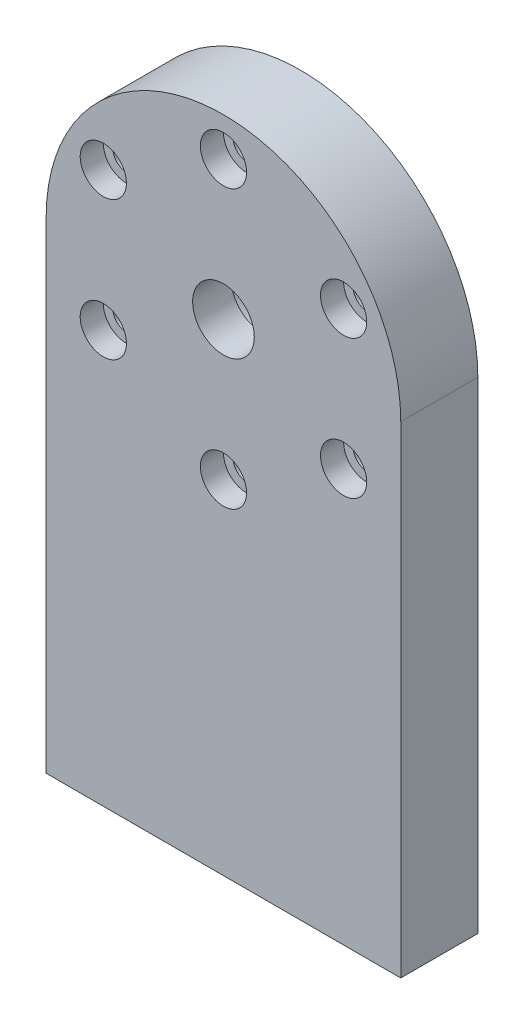
ISO-10303-21;
HEADER;
FILE_DESCRIPTION(('STEP AP214'),'2;1');
FILE_NAME('part.step','',(''),(''),'','','');
FILE_SCHEMA(('AUTOMOTIVE_DESIGN { 1 0 10303 214 1 1 1 1 }'));
ENDSEC;
DATA;
#1=APPLICATION_CONTEXT('core data for automotive mechanical design processes');
#2=APPLICATION_PROTOCOL_DEFINITION('international standard','automotive_design',2000,#1);
#3=PRODUCT_CONTEXT('',#1,'mechanical');
#4=PRODUCT('Part','Part','',(#3));
#5=PRODUCT_RELATED_PRODUCT_CATEGORY('part','',(#4));
#6=PRODUCT_DEFINITION_FORMATION('','',#4);
#7=PRODUCT_DEFINITION_CONTEXT('part definition',#1,'design');
#8=PRODUCT_DEFINITION('design','',#6,#7);
#9=PRODUCT_DEFINITION_SHAPE('','',#8);
#10=(LENGTH_UNIT() NAMED_UNIT(*) SI_UNIT(.MILLI.,.METRE.));
#11=(NAMED_UNIT(*) PLANE_ANGLE_UNIT() SI_UNIT($,.RADIAN.));
#12=(NAMED_UNIT(*) SI_UNIT($,.STERADIAN.) SOLID_ANGLE_UNIT());
#13=UNCERTAINTY_MEASURE_WITH_UNIT(LENGTH_MEASURE(1.E-05),#10,'distance_accuracy_value','');
#14=(GEOMETRIC_REPRESENTATION_CONTEXT(3) GLOBAL_UNCERTAINTY_ASSIGNED_CONTEXT((#13)) GLOBAL_UNIT_ASSIGNED_CONTEXT((#10,
#11,#12)) REPRESENTATION_CONTEXT('',''));
#15=CARTESIAN_POINT('',(0.,0.,0.));
#16=DIRECTION('',(0.,0.,1.));
#17=DIRECTION('',(1.,0.,0.));
#18=AXIS2_PLACEMENT_3D('',#15,#16,#17);
#19=CARTESIAN_POINT('',(0.,125.,10.));
#20=DIRECTION('',(0.,0.,-1.));
#21=DIRECTION('',(-1.,0.,0.));
#22=AXIS2_PLACEMENT_3D('',#19,#20,#21);
#23=CYLINDRICAL_SURFACE('',#22,8.);
#24=CARTESIAN_POINT('',(0.,125.,10.));
#25=DIRECTION('',(0.,0.,1.));
#26=DIRECTION('',(1.,0.,0.));
#27=AXIS2_PLACEMENT_3D('',#24,#25,#26);
#28=CIRCLE('',#27,8.);
#29=CARTESIAN_POINT('',(8.,125.,10.));
#30=VERTEX_POINT('',#29);
#31=EDGE_CURVE('E192',#30,#30,#28,.T.);
#32=ORIENTED_EDGE('',*,*,#31,.T.);
#33=EDGE_LOOP('',(#32));
#34=FACE_BOUND('',#33,.T.);
#35=CARTESIAN_POINT('',(0.,125.,0.));
#36=DIRECTION('',(0.,0.,-1.));
#37=DIRECTION('',(-1.,0.,0.));
#38=AXIS2_PLACEMENT_3D('',#35,#36,#37);
#39=CIRCLE('',#38,8.);
#40=CARTESIAN_POINT('',(-8.,125.,0.));
#41=VERTEX_POINT('',#40);
#42=EDGE_CURVE('E43',#41,#41,#39,.T.);
#43=ORIENTED_EDGE('',*,*,#42,.T.);
#44=EDGE_LOOP('',(#43));
#45=FACE_BOUND('',#44,.T.);
#46=ADVANCED_FACE('F39',(#34,#45),#23,.F.);
#47=CARTESIAN_POINT('',(0.,161.,-10.));
#48=DIRECTION('',(0.,0.,1.));
#49=DIRECTION('',(1.,0.,0.));
#50=AXIS2_PLACEMENT_3D('',#47,#48,#49);
#51=CYLINDRICAL_SURFACE('',#50,3.5);
#52=CARTESIAN_POINT('',(0.,161.,-10.));
#53=DIRECTION('',(0.,0.,1.));
#54=DIRECTION('',(1.,0.,0.));
#55=AXIS2_PLACEMENT_3D('',#52,#53,#54);
#56=CIRCLE('',#55,3.5);
#57=CARTESIAN_POINT('',(3.5,161.,-10.));
#58=VERTEX_POINT('',#57);
#59=EDGE_CURVE('E189',#58,#58,#56,.T.);
#60=ORIENTED_EDGE('',*,*,#59,.F.);
#61=EDGE_LOOP('',(#60));
#62=FACE_BOUND('',#61,.T.);
#63=CARTESIAN_POINT('',(0.,161.,4.));
#64=DIRECTION('',(0.,0.,1.));
#65=DIRECTION('',(1.,0.,0.));
#66=AXIS2_PLACEMENT_3D('',#63,#64,#65);
#67=CIRCLE('',#66,3.5);
#68=CARTESIAN_POINT('',(3.5,161.,4.));
#69=VERTEX_POINT('',#68);
#70=EDGE_CURVE('E186',#69,#69,#67,.F.);
#71=ORIENTED_EDGE('',*,*,#70,.F.);
#72=EDGE_LOOP('',(#71));
#73=FACE_BOUND('',#72,.T.);
#74=ADVANCED_FACE('F217',(#62,#73),#51,.F.);
#75=CARTESIAN_POINT('',(0.,125.,10.));
#76=DIRECTION('',(0.,0.,1.));
#77=DIRECTION('',(1.,0.,0.));
#78=AXIS2_PLACEMENT_3D('',#75,#76,#77);
#79=PLANE('',#78);
#80=CARTESIAN_POINT('',(31.1769145362396,143.,10.));
#81=DIRECTION('',(0.,0.,1.));
#82=DIRECTION('',(0.50000000000001,-0.866025403784433,0.));
#83=AXIS2_PLACEMENT_3D('',#80,#81,#82);
#84=CIRCLE('',#83,6.);
#85=CARTESIAN_POINT('',(34.1769145362396,137.803847577294,10.));
#86=VERTEX_POINT('',#85);
#87=EDGE_CURVE('E122',#86,#86,#84,.T.);
#88=ORIENTED_EDGE('',*,*,#87,.F.);
#89=EDGE_LOOP('',(#88));
#90=FACE_BOUND('',#89,.T.);
#91=CARTESIAN_POINT('',(31.17691453624,107.,10.));
#92=DIRECTION('',(0.,0.,1.));
#93=DIRECTION('',(-0.499999999999992,-0.866025403784443,0.));
#94=AXIS2_PLACEMENT_3D('',#91,#92,#93);
#95=CIRCLE('',#94,6.);
#96=CARTESIAN_POINT('',(28.17691453624,101.803847577294,10.));
#97=VERTEX_POINT('',#96);
#98=EDGE_CURVE('E137',#97,#97,#95,.T.);
#99=ORIENTED_EDGE('',*,*,#98,.F.);
#100=EDGE_LOOP('',(#99));
#101=FACE_BOUND('',#100,.T.);
#102=CARTESIAN_POINT('',(0.,89.,10.));
#103=DIRECTION('',(0.,0.,1.));
#104=DIRECTION('',(-1.,0.,0.));
#105=AXIS2_PLACEMENT_3D('',#102,#103,#104);
#106=CIRCLE('',#105,6.);
#107=CARTESIAN_POINT('',(-6.,89.,10.));
#108=VERTEX_POINT('',#107);
#109=EDGE_CURVE('E131',#108,#108,#106,.T.);
#110=ORIENTED_EDGE('',*,*,#109,.F.);
#111=EDGE_LOOP('',(#110));
#112=FACE_BOUND('',#111,.T.);
#113=CARTESIAN_POINT('',(-31.1769145362397,107.,10.));
#114=DIRECTION('',(0.,0.,1.));
#115=DIRECTION('',(-0.500000000000004,0.866025403784436,0.));
#116=AXIS2_PLACEMENT_3D('',#113,#114,#115);
#117=CIRCLE('',#116,6.);
#118=CARTESIAN_POINT('',(-34.1769145362397,112.196152422706,10.));
#119=VERTEX_POINT('',#118);
#120=EDGE_CURVE('E123',#119,#119,#117,.T.);
#121=ORIENTED_EDGE('',*,*,#120,.F.);
#122=EDGE_LOOP('',(#121));
#123=FACE_BOUND('',#122,.T.);
#124=CARTESIAN_POINT('',(-31.1769145362398,143.,10.));
#125=DIRECTION('',(0.,0.,1.));
#126=DIRECTION('',(0.499999999999998,0.86602540378444,0.));
#127=AXIS2_PLACEMENT_3D('',#124,#125,#126);
#128=CIRCLE('',#127,6.);
#129=CARTESIAN_POINT('',(-28.1769145362399,148.196152422707,10.));
#130=VERTEX_POINT('',#129);
#131=EDGE_CURVE('E130',#130,#130,#128,.T.);
#132=ORIENTED_EDGE('',*,*,#131,.F.);
#133=EDGE_LOOP('',(#132));
#134=FACE_BOUND('',#133,.T.);
#135=CARTESIAN_POINT('',(0.,161.,10.));
#136=DIRECTION('',(0.,0.,1.));
#137=DIRECTION('',(1.,0.,0.));
#138=AXIS2_PLACEMENT_3D('',#135,#136,#137);
#139=CIRCLE('',#138,6.);
#140=CARTESIAN_POINT('',(6.,161.,10.));
#141=VERTEX_POINT('',#140);
#142=EDGE_CURVE('E182',#141,#141,#139,.T.);
#143=ORIENTED_EDGE('',*,*,#142,.F.);
#144=EDGE_LOOP('',(#143));
#145=FACE_BOUND('',#144,.T.);
#146=CARTESIAN_POINT('',(0.,125.,10.));
#147=DIRECTION('',(0.,0.,1.));
#148=DIRECTION('',(1.,0.,0.));
#149=AXIS2_PLACEMENT_3D('',#146,#147,#148);
#150=CIRCLE('',#149,46.);
#151=CARTESIAN_POINT('',(46.,125.,10.));
#152=VERTEX_POINT('',#151);
#153=CARTESIAN_POINT('',(-46.,125.,10.));
#154=VERTEX_POINT('',#153);
#155=EDGE_CURVE('E196',#152,#154,#150,.T.);
#156=ORIENTED_EDGE('',*,*,#155,.T.);
#157=DIRECTION('',(0.,-1.,0.));
#158=VECTOR('',#157,1.);
#159=CARTESIAN_POINT('',(-46.,0.,10.));
#160=LINE('',#159,#158);
#161=CARTESIAN_POINT('',(-46.,0.,10.));
#162=VERTEX_POINT('',#161);
#163=EDGE_CURVE('E89',#154,#162,#160,.T.);
#164=ORIENTED_EDGE('',*,*,#163,.T.);
#165=DIRECTION('',(1.,0.,0.));
#166=VECTOR('',#165,1.);
#167=CARTESIAN_POINT('',(46.,0.,10.));
#168=LINE('',#167,#166);
#169=CARTESIAN_POINT('',(46.,0.,10.));
#170=VERTEX_POINT('',#169);
#171=EDGE_CURVE('E199',#162,#170,#168,.T.);
#172=ORIENTED_EDGE('',*,*,#171,.T.);
#173=DIRECTION('',(0.,1.,0.));
#174=VECTOR('',#173,1.);
#175=CARTESIAN_POINT('',(46.,125.,10.));
#176=LINE('',#175,#174);
#177=EDGE_CURVE('E58',#170,#152,#176,.T.);
#178=ORIENTED_EDGE('',*,*,#177,.T.);
#179=EDGE_LOOP('',(#156,#164,#172,#178));
#180=FACE_BOUND('',#179,.T.);
#181=ORIENTED_EDGE('',*,*,#31,.F.);
#182=EDGE_LOOP('',(#181));
#183=FACE_BOUND('',#182,.T.);
#184=ADVANCED_FACE('F219',(#90,#101,#112,#123,#134,#145,#180,#183),#79,.T.);
#185=CARTESIAN_POINT('',(0.,125.,-10.));
#186=DIRECTION('',(0.,0.,1.));
#187=DIRECTION('',(1.,0.,0.));
#188=AXIS2_PLACEMENT_3D('',#185,#186,#187);
#189=PLANE('',#188);
#190=CARTESIAN_POINT('',(0.,125.,-10.));
#191=DIRECTION('',(0.,0.,-1.));
#192=DIRECTION('',(-1.,0.,0.));
#193=AXIS2_PLACEMENT_3D('',#190,#191,#192);
#194=CIRCLE('',#193,12.5);
#195=CARTESIAN_POINT('',(-12.5,125.,-10.));
#196=VERTEX_POINT('',#195);
#197=EDGE_CURVE('E265',#196,#196,#194,.T.);
#198=ORIENTED_EDGE('',*,*,#197,.F.);
#199=EDGE_LOOP('',(#198));
#200=FACE_BOUND('',#199,.T.);
#201=CARTESIAN_POINT('',(31.1769145362396,143.,-10.));
#202=DIRECTION('',(0.,0.,1.));
#203=DIRECTION('',(0.50000000000001,-0.866025403784433,0.));
#204=AXIS2_PLACEMENT_3D('',#201,#202,#203);
#205=CIRCLE('',#204,3.5);
#206=CARTESIAN_POINT('',(32.9269145362396,139.968911086755,-10.));
#207=VERTEX_POINT('',#206);
#208=EDGE_CURVE('E167',#207,#207,#205,.T.);
#209=ORIENTED_EDGE('',*,*,#208,.T.);
#210=EDGE_LOOP('',(#209));
#211=FACE_BOUND('',#210,.T.);
#212=CARTESIAN_POINT('',(31.17691453624,107.,-10.));
#213=DIRECTION('',(0.,0.,1.));
#214=DIRECTION('',(-0.499999999999992,-0.866025403784443,0.));
#215=AXIS2_PLACEMENT_3D('',#212,#213,#214);
#216=CIRCLE('',#215,3.5);
#217=CARTESIAN_POINT('',(29.42691453624,103.968911086755,-10.));
#218=VERTEX_POINT('',#217);
#219=EDGE_CURVE('E175',#218,#218,#216,.T.);
#220=ORIENTED_EDGE('',*,*,#219,.T.);
#221=EDGE_LOOP('',(#220));
#222=FACE_BOUND('',#221,.T.);
#223=CARTESIAN_POINT('',(0.,89.,-10.));
#224=DIRECTION('',(0.,0.,1.));
#225=DIRECTION('',(-1.,0.,0.));
#226=AXIS2_PLACEMENT_3D('',#223,#224,#225);
#227=CIRCLE('',#226,3.5);
#228=CARTESIAN_POINT('',(-3.5,89.,-10.));
#229=VERTEX_POINT('',#228);
#230=EDGE_CURVE('E172',#229,#229,#227,.T.);
#231=ORIENTED_EDGE('',*,*,#230,.T.);
#232=EDGE_LOOP('',(#231));
#233=FACE_BOUND('',#232,.T.);
#234=CARTESIAN_POINT('',(-31.1769145362397,107.,-10.));
#235=DIRECTION('',(0.,0.,1.));
#236=DIRECTION('',(-0.500000000000004,0.866025403784436,0.));
#237=AXIS2_PLACEMENT_3D('',#234,#235,#236);
#238=CIRCLE('',#237,3.5);
#239=CARTESIAN_POINT('',(-32.9269145362397,110.031088913245,-10.));
#240=VERTEX_POINT('',#239);
#241=EDGE_CURVE('E168',#240,#240,#238,.T.);
#242=ORIENTED_EDGE('',*,*,#241,.T.);
#243=EDGE_LOOP('',(#242));
#244=FACE_BOUND('',#243,.T.);
#245=CARTESIAN_POINT('',(-31.1769145362398,143.,-10.));
#246=DIRECTION('',(0.,0.,1.));
#247=DIRECTION('',(0.499999999999998,0.86602540378444,0.));
#248=AXIS2_PLACEMENT_3D('',#245,#246,#247);
#249=CIRCLE('',#248,3.5);
#250=CARTESIAN_POINT('',(-29.4269145362398,146.031088913245,-10.));
#251=VERTEX_POINT('',#250);
#252=EDGE_CURVE('E171',#251,#251,#249,.T.);
#253=ORIENTED_EDGE('',*,*,#252,.T.);
#254=EDGE_LOOP('',(#253));
#255=FACE_BOUND('',#254,.T.);
#256=ORIENTED_EDGE('',*,*,#59,.T.);
#257=EDGE_LOOP('',(#256));
#258=FACE_BOUND('',#257,.T.);
#259=CARTESIAN_POINT('',(0.,125.,-10.));
#260=DIRECTION('',(0.,0.,1.));
#261=DIRECTION('',(1.,0.,0.));
#262=AXIS2_PLACEMENT_3D('',#259,#260,#261);
#263=CIRCLE('',#262,46.);
#264=CARTESIAN_POINT('',(46.,125.,-10.));
#265=VERTEX_POINT('',#264);
#266=CARTESIAN_POINT('',(-46.,125.,-10.));
#267=VERTEX_POINT('',#266);
#268=EDGE_CURVE('E195',#265,#267,#263,.T.);
#269=ORIENTED_EDGE('',*,*,#268,.F.);
#270=DIRECTION('',(0.,1.,0.));
#271=VECTOR('',#270,1.);
#272=CARTESIAN_POINT('',(46.,125.,-10.));
#273=LINE('',#272,#271);
#274=CARTESIAN_POINT('',(46.,0.,-10.));
#275=VERTEX_POINT('',#274);
#276=EDGE_CURVE('E82',#275,#265,#273,.T.);
#277=ORIENTED_EDGE('',*,*,#276,.F.);
#278=DIRECTION('',(1.,0.,0.));
#279=VECTOR('',#278,1.);
#280=CARTESIAN_POINT('',(46.,0.,-10.));
#281=LINE('',#280,#279);
#282=CARTESIAN_POINT('',(-46.,0.,-10.));
#283=VERTEX_POINT('',#282);
#284=EDGE_CURVE('E76',#283,#275,#281,.T.);
#285=ORIENTED_EDGE('',*,*,#284,.F.);
#286=DIRECTION('',(0.,-1.,0.));
#287=VECTOR('',#286,1.);
#288=CARTESIAN_POINT('',(-46.,0.,-10.));
#289=LINE('',#288,#287);
#290=EDGE_CURVE('E205',#267,#283,#289,.T.);
#291=ORIENTED_EDGE('',*,*,#290,.F.);
#292=EDGE_LOOP('',(#269,#277,#285,#291));
#293=FACE_BOUND('',#292,.T.);
#294=ADVANCED_FACE('F226',(#200,#211,#222,#233,#244,#255,#258,#293),#189,.F.);
#295=CARTESIAN_POINT('',(0.,125.,10.));
#296=DIRECTION('',(0.,0.,-1.));
#297=DIRECTION('',(-1.,0.,0.));
#298=AXIS2_PLACEMENT_3D('',#295,#296,#297);
#299=CYLINDRICAL_SURFACE('',#298,46.);
#300=ORIENTED_EDGE('',*,*,#268,.T.);
#301=DIRECTION('',(0.,0.,-1.));
#302=VECTOR('',#301,1.);
#303=CARTESIAN_POINT('',(-46.,125.,10.));
#304=LINE('',#303,#302);
#305=EDGE_CURVE('E11',#154,#267,#304,.T.);
#306=ORIENTED_EDGE('',*,*,#305,.F.);
#307=ORIENTED_EDGE('',*,*,#155,.F.);
#308=DIRECTION('',(0.,0.,-1.));
#309=VECTOR('',#308,1.);
#310=CARTESIAN_POINT('',(46.,125.,10.));
#311=LINE('',#310,#309);
#312=EDGE_CURVE('E202',#152,#265,#311,.T.);
#313=ORIENTED_EDGE('',*,*,#312,.T.);
#314=EDGE_LOOP('',(#300,#306,#307,#313));
#315=FACE_BOUND('',#314,.T.);
#316=ADVANCED_FACE('F41',(#315),#299,.T.);
#317=CARTESIAN_POINT('',(-46.,0.,10.));
#318=DIRECTION('',(1.,0.,0.));
#319=DIRECTION('',(0.,0.,-1.));
#320=AXIS2_PLACEMENT_3D('',#317,#318,#319);
#321=PLANE('',#320);
#322=ORIENTED_EDGE('',*,*,#290,.T.);
#323=DIRECTION('',(0.,0.,-1.));
#324=VECTOR('',#323,1.);
#325=CARTESIAN_POINT('',(-46.,0.,10.));
#326=LINE('',#325,#324);
#327=EDGE_CURVE('E49',#162,#283,#326,.T.);
#328=ORIENTED_EDGE('',*,*,#327,.F.);
#329=ORIENTED_EDGE('',*,*,#163,.F.);
#330=ORIENTED_EDGE('',*,*,#305,.T.);
#331=EDGE_LOOP('',(#322,#328,#329,#330));
#332=FACE_BOUND('',#331,.T.);
#333=ADVANCED_FACE('F244',(#332),#321,.F.);
#334=CARTESIAN_POINT('',(46.,0.,10.));
#335=DIRECTION('',(0.,1.,0.));
#336=DIRECTION('',(0.,0.,1.));
#337=AXIS2_PLACEMENT_3D('',#334,#335,#336);
#338=PLANE('',#337);
#339=CARTESIAN_POINT('',(30.,0.,0.));
#340=DIRECTION('',(0.,-1.,0.));
#341=DIRECTION('',(0.,0.,-1.));
#342=AXIS2_PLACEMENT_3D('',#339,#340,#341);
#343=CIRCLE('',#342,4.425);
#344=CARTESIAN_POINT('',(30.,0.,-4.425));
#345=VERTEX_POINT('',#344);
#346=EDGE_CURVE('E113',#345,#345,#343,.T.);
#347=ORIENTED_EDGE('',*,*,#346,.F.);
#348=EDGE_LOOP('',(#347));
#349=FACE_BOUND('',#348,.T.);
#350=CARTESIAN_POINT('',(-30.,0.,0.));
#351=DIRECTION('',(0.,-1.,0.));
#352=DIRECTION('',(0.,0.,-1.));
#353=AXIS2_PLACEMENT_3D('',#350,#351,#352);
#354=CIRCLE('',#353,4.425);
#355=CARTESIAN_POINT('',(-30.,0.,-4.425));
#356=VERTEX_POINT('',#355);
#357=EDGE_CURVE('E106',#356,#356,#354,.T.);
#358=ORIENTED_EDGE('',*,*,#357,.F.);
#359=EDGE_LOOP('',(#358));
#360=FACE_BOUND('',#359,.T.);
#361=ORIENTED_EDGE('',*,*,#284,.T.);
#362=DIRECTION('',(0.,0.,-1.));
#363=VECTOR('',#362,1.);
#364=CARTESIAN_POINT('',(46.,0.,10.));
#365=LINE('',#364,#363);
#366=EDGE_CURVE('E210',#170,#275,#365,.T.);
#367=ORIENTED_EDGE('',*,*,#366,.F.);
#368=ORIENTED_EDGE('',*,*,#171,.F.);
#369=ORIENTED_EDGE('',*,*,#327,.T.);
#370=EDGE_LOOP('',(#361,#367,#368,#369));
#371=FACE_BOUND('',#370,.T.);
#372=ADVANCED_FACE('F242',(#349,#360,#371),#338,.F.);
#373=CARTESIAN_POINT('',(46.,125.,10.));
#374=DIRECTION('',(-1.,0.,0.));
#375=DIRECTION('',(0.,0.,1.));
#376=AXIS2_PLACEMENT_3D('',#373,#374,#375);
#377=PLANE('',#376);
#378=ORIENTED_EDGE('',*,*,#276,.T.);
#379=ORIENTED_EDGE('',*,*,#312,.F.);
#380=ORIENTED_EDGE('',*,*,#177,.F.);
#381=ORIENTED_EDGE('',*,*,#366,.T.);
#382=EDGE_LOOP('',(#378,#379,#380,#381));
#383=FACE_BOUND('',#382,.T.);
#384=ADVANCED_FACE('F239',(#383),#377,.F.);
#385=CARTESIAN_POINT('',(0.,161.,4.));
#386=DIRECTION('',(0.,0.,1.));
#387=DIRECTION('',(1.,0.,0.));
#388=AXIS2_PLACEMENT_3D('',#385,#386,#387);
#389=PLANE('',#388);
#390=CARTESIAN_POINT('',(0.,161.,4.));
#391=DIRECTION('',(0.,0.,1.));
#392=DIRECTION('',(1.,0.,0.));
#393=AXIS2_PLACEMENT_3D('',#390,#391,#392);
#394=CIRCLE('',#393,6.);
#395=CARTESIAN_POINT('',(6.,161.,4.));
#396=VERTEX_POINT('',#395);
#397=EDGE_CURVE('E183',#396,#396,#394,.T.);
#398=ORIENTED_EDGE('',*,*,#397,.T.);
#399=EDGE_LOOP('',(#398));
#400=FACE_BOUND('',#399,.T.);
#401=ORIENTED_EDGE('',*,*,#70,.T.);
#402=EDGE_LOOP('',(#401));
#403=FACE_BOUND('',#402,.T.);
#404=ADVANCED_FACE('F215',(#400,#403),#389,.T.);
#405=CARTESIAN_POINT('',(0.,161.,4.));
#406=DIRECTION('',(0.,0.,1.));
#407=DIRECTION('',(1.,0.,0.));
#408=AXIS2_PLACEMENT_3D('',#405,#406,#407);
#409=CYLINDRICAL_SURFACE('',#408,6.);
#410=ORIENTED_EDGE('',*,*,#397,.F.);
#411=EDGE_LOOP('',(#410));
#412=FACE_BOUND('',#411,.T.);
#413=ORIENTED_EDGE('',*,*,#142,.T.);
#414=EDGE_LOOP('',(#413));
#415=FACE_BOUND('',#414,.T.);
#416=ADVANCED_FACE('F233',(#412,#415),#409,.F.);
#417=CARTESIAN_POINT('',(-31.1769145362398,143.,-10.));
#418=DIRECTION('',(0.,0.,1.));
#419=DIRECTION('',(0.499999999999998,0.86602540378444,0.));
#420=AXIS2_PLACEMENT_3D('',#417,#418,#419);
#421=CYLINDRICAL_SURFACE('',#420,3.5);
#422=ORIENTED_EDGE('',*,*,#252,.F.);
#423=EDGE_LOOP('',(#422));
#424=FACE_BOUND('',#423,.T.);
#425=CARTESIAN_POINT('',(-31.1769145362398,143.,4.));
#426=DIRECTION('',(0.,0.,1.));
#427=DIRECTION('',(1.,0.,0.));
#428=AXIS2_PLACEMENT_3D('',#425,#426,#427);
#429=CIRCLE('',#428,3.5);
#430=CARTESIAN_POINT('',(-27.6769145362398,143.,4.));
#431=VERTEX_POINT('',#430);
#432=EDGE_CURVE('E164',#431,#431,#429,.F.);
#433=ORIENTED_EDGE('',*,*,#432,.F.);
#434=EDGE_LOOP('',(#433));
#435=FACE_BOUND('',#434,.T.);
#436=ADVANCED_FACE('F286',(#424,#435),#421,.F.);
#437=CARTESIAN_POINT('',(-31.1769145362397,107.,-10.));
#438=DIRECTION('',(0.,0.,1.));
#439=DIRECTION('',(-0.500000000000004,0.866025403784436,0.));
#440=AXIS2_PLACEMENT_3D('',#437,#438,#439);
#441=CYLINDRICAL_SURFACE('',#440,3.5);
#442=ORIENTED_EDGE('',*,*,#241,.F.);
#443=EDGE_LOOP('',(#442));
#444=FACE_BOUND('',#443,.T.);
#445=CARTESIAN_POINT('',(-31.1769145362397,107.,4.));
#446=DIRECTION('',(0.,0.,1.));
#447=DIRECTION('',(1.,0.,0.));
#448=AXIS2_PLACEMENT_3D('',#445,#446,#447);
#449=CIRCLE('',#448,3.5);
#450=CARTESIAN_POINT('',(-27.6769145362397,107.,4.));
#451=VERTEX_POINT('',#450);
#452=EDGE_CURVE('E161',#451,#451,#449,.F.);
#453=ORIENTED_EDGE('',*,*,#452,.F.);
#454=EDGE_LOOP('',(#453));
#455=FACE_BOUND('',#454,.T.);
#456=ADVANCED_FACE('F289',(#444,#455),#441,.F.);
#457=CARTESIAN_POINT('',(0.,89.,-10.));
#458=DIRECTION('',(0.,0.,1.));
#459=DIRECTION('',(-1.,0.,0.));
#460=AXIS2_PLACEMENT_3D('',#457,#458,#459);
#461=CYLINDRICAL_SURFACE('',#460,3.5);
#462=ORIENTED_EDGE('',*,*,#230,.F.);
#463=EDGE_LOOP('',(#462));
#464=FACE_BOUND('',#463,.T.);
#465=CARTESIAN_POINT('',(0.,89.,4.));
#466=DIRECTION('',(0.,0.,1.));
#467=DIRECTION('',(1.,0.,0.));
#468=AXIS2_PLACEMENT_3D('',#465,#466,#467);
#469=CIRCLE('',#468,3.5);
#470=CARTESIAN_POINT('',(3.5,89.,4.));
#471=VERTEX_POINT('',#470);
#472=EDGE_CURVE('E158',#471,#471,#469,.F.);
#473=ORIENTED_EDGE('',*,*,#472,.F.);
#474=EDGE_LOOP('',(#473));
#475=FACE_BOUND('',#474,.T.);
#476=ADVANCED_FACE('F313',(#464,#475),#461,.F.);
#477=CARTESIAN_POINT('',(31.17691453624,107.,-10.));
#478=DIRECTION('',(0.,0.,1.));
#479=DIRECTION('',(-0.499999999999992,-0.866025403784443,0.));
#480=AXIS2_PLACEMENT_3D('',#477,#478,#479);
#481=CYLINDRICAL_SURFACE('',#480,3.5);
#482=ORIENTED_EDGE('',*,*,#219,.F.);
#483=EDGE_LOOP('',(#482));
#484=FACE_BOUND('',#483,.T.);
#485=CARTESIAN_POINT('',(31.17691453624,107.,4.));
#486=DIRECTION('',(0.,0.,1.));
#487=DIRECTION('',(1.,0.,0.));
#488=AXIS2_PLACEMENT_3D('',#485,#486,#487);
#489=CIRCLE('',#488,3.5);
#490=CARTESIAN_POINT('',(34.67691453624,107.,4.));
#491=VERTEX_POINT('',#490);
#492=EDGE_CURVE('E155',#491,#491,#489,.F.);
#493=ORIENTED_EDGE('',*,*,#492,.F.);
#494=EDGE_LOOP('',(#493));
#495=FACE_BOUND('',#494,.T.);
#496=ADVANCED_FACE('F317',(#484,#495),#481,.F.);
#497=CARTESIAN_POINT('',(31.1769145362396,143.,-10.));
#498=DIRECTION('',(0.,0.,1.));
#499=DIRECTION('',(0.50000000000001,-0.866025403784433,0.));
#500=AXIS2_PLACEMENT_3D('',#497,#498,#499);
#501=CYLINDRICAL_SURFACE('',#500,3.5);
#502=ORIENTED_EDGE('',*,*,#208,.F.);
#503=EDGE_LOOP('',(#502));
#504=FACE_BOUND('',#503,.T.);
#505=CARTESIAN_POINT('',(31.1769145362396,143.,4.));
#506=DIRECTION('',(0.,0.,1.));
#507=DIRECTION('',(1.,0.,0.));
#508=AXIS2_PLACEMENT_3D('',#505,#506,#507);
#509=CIRCLE('',#508,3.5);
#510=CARTESIAN_POINT('',(34.6769145362396,143.,4.));
#511=VERTEX_POINT('',#510);
#512=EDGE_CURVE('E152',#511,#511,#509,.F.);
#513=ORIENTED_EDGE('',*,*,#512,.F.);
#514=EDGE_LOOP('',(#513));
#515=FACE_BOUND('',#514,.T.);
#516=ADVANCED_FACE('F321',(#504,#515),#501,.F.);
#517=CARTESIAN_POINT('',(31.1769145362396,143.,4.));
#518=DIRECTION('',(0.,0.,1.));
#519=DIRECTION('',(0.50000000000001,-0.866025403784433,0.));
#520=AXIS2_PLACEMENT_3D('',#517,#518,#519);
#521=PLANE('',#520);
#522=CARTESIAN_POINT('',(31.1769145362396,143.,4.));
#523=DIRECTION('',(0.,0.,1.));
#524=DIRECTION('',(0.50000000000001,-0.866025403784433,0.));
#525=AXIS2_PLACEMENT_3D('',#522,#523,#524);
#526=CIRCLE('',#525,6.);
#527=CARTESIAN_POINT('',(34.1769145362396,137.803847577294,4.));
#528=VERTEX_POINT('',#527);
#529=EDGE_CURVE('E140',#528,#528,#526,.T.);
#530=ORIENTED_EDGE('',*,*,#529,.T.);
#531=EDGE_LOOP('',(#530));
#532=FACE_BOUND('',#531,.T.);
#533=ORIENTED_EDGE('',*,*,#512,.T.);
#534=EDGE_LOOP('',(#533));
#535=FACE_BOUND('',#534,.T.);
#536=ADVANCED_FACE('F324',(#532,#535),#521,.T.);
#537=CARTESIAN_POINT('',(31.1769145362396,143.,4.));
#538=DIRECTION('',(0.,0.,1.));
#539=DIRECTION('',(0.50000000000001,-0.866025403784433,0.));
#540=AXIS2_PLACEMENT_3D('',#537,#538,#539);
#541=CYLINDRICAL_SURFACE('',#540,6.);
#542=ORIENTED_EDGE('',*,*,#529,.F.);
#543=EDGE_LOOP('',(#542));
#544=FACE_BOUND('',#543,.T.);
#545=ORIENTED_EDGE('',*,*,#87,.T.);
#546=EDGE_LOOP('',(#545));
#547=FACE_BOUND('',#546,.T.);
#548=ADVANCED_FACE('F367',(#544,#547),#541,.F.);
#549=CARTESIAN_POINT('',(31.17691453624,107.,4.));
#550=DIRECTION('',(0.,0.,1.));
#551=DIRECTION('',(-0.499999999999992,-0.866025403784443,0.));
#552=AXIS2_PLACEMENT_3D('',#549,#550,#551);
#553=PLANE('',#552);
#554=CARTESIAN_POINT('',(31.17691453624,107.,4.));
#555=DIRECTION('',(0.,0.,1.));
#556=DIRECTION('',(-0.499999999999992,-0.866025403784443,0.));
#557=AXIS2_PLACEMENT_3D('',#554,#555,#556);
#558=CIRCLE('',#557,6.);
#559=CARTESIAN_POINT('',(28.17691453624,101.803847577294,4.));
#560=VERTEX_POINT('',#559);
#561=EDGE_CURVE('E134',#560,#560,#558,.T.);
#562=ORIENTED_EDGE('',*,*,#561,.T.);
#563=EDGE_LOOP('',(#562));
#564=FACE_BOUND('',#563,.T.);
#565=ORIENTED_EDGE('',*,*,#492,.T.);
#566=EDGE_LOOP('',(#565));
#567=FACE_BOUND('',#566,.T.);
#568=ADVANCED_FACE('F375',(#564,#567),#553,.T.);
#569=CARTESIAN_POINT('',(31.17691453624,107.,4.));
#570=DIRECTION('',(0.,0.,1.));
#571=DIRECTION('',(-0.499999999999992,-0.866025403784443,0.));
#572=AXIS2_PLACEMENT_3D('',#569,#570,#571);
#573=CYLINDRICAL_SURFACE('',#572,6.);
#574=ORIENTED_EDGE('',*,*,#561,.F.);
#575=EDGE_LOOP('',(#574));
#576=FACE_BOUND('',#575,.T.);
#577=ORIENTED_EDGE('',*,*,#98,.T.);
#578=EDGE_LOOP('',(#577));
#579=FACE_BOUND('',#578,.T.);
#580=ADVANCED_FACE('F383',(#576,#579),#573,.F.);
#581=CARTESIAN_POINT('',(0.,89.,4.));
#582=DIRECTION('',(0.,0.,1.));
#583=DIRECTION('',(-1.,0.,0.));
#584=AXIS2_PLACEMENT_3D('',#581,#582,#583);
#585=PLANE('',#584);
#586=CARTESIAN_POINT('',(0.,89.,4.));
#587=DIRECTION('',(0.,0.,1.));
#588=DIRECTION('',(-1.,0.,0.));
#589=AXIS2_PLACEMENT_3D('',#586,#587,#588);
#590=CIRCLE('',#589,6.);
#591=CARTESIAN_POINT('',(-6.,89.,4.));
#592=VERTEX_POINT('',#591);
#593=EDGE_CURVE('E127',#592,#592,#590,.T.);
#594=ORIENTED_EDGE('',*,*,#593,.T.);
#595=EDGE_LOOP('',(#594));
#596=FACE_BOUND('',#595,.T.);
#597=ORIENTED_EDGE('',*,*,#472,.T.);
#598=EDGE_LOOP('',(#597));
#599=FACE_BOUND('',#598,.T.);
#600=ADVANCED_FACE('F391',(#596,#599),#585,.T.);
#601=CARTESIAN_POINT('',(0.,89.,4.));
#602=DIRECTION('',(0.,0.,1.));
#603=DIRECTION('',(-1.,0.,0.));
#604=AXIS2_PLACEMENT_3D('',#601,#602,#603);
#605=CYLINDRICAL_SURFACE('',#604,6.);
#606=ORIENTED_EDGE('',*,*,#593,.F.);
#607=EDGE_LOOP('',(#606));
#608=FACE_BOUND('',#607,.T.);
#609=ORIENTED_EDGE('',*,*,#109,.T.);
#610=EDGE_LOOP('',(#609));
#611=FACE_BOUND('',#610,.T.);
#612=ADVANCED_FACE('F399',(#608,#611),#605,.F.);
#613=CARTESIAN_POINT('',(-31.1769145362397,107.,4.));
#614=DIRECTION('',(0.,0.,1.));
#615=DIRECTION('',(-0.500000000000004,0.866025403784436,0.));
#616=AXIS2_PLACEMENT_3D('',#613,#614,#615);
#617=PLANE('',#616);
#618=CARTESIAN_POINT('',(-31.1769145362397,107.,4.));
#619=DIRECTION('',(0.,0.,1.));
#620=DIRECTION('',(-0.500000000000004,0.866025403784436,0.));
#621=AXIS2_PLACEMENT_3D('',#618,#619,#620);
#622=CIRCLE('',#621,6.);
#623=CARTESIAN_POINT('',(-34.1769145362397,112.196152422706,4.));
#624=VERTEX_POINT('',#623);
#625=EDGE_CURVE('E126',#624,#624,#622,.T.);
#626=ORIENTED_EDGE('',*,*,#625,.T.);
#627=EDGE_LOOP('',(#626));
#628=FACE_BOUND('',#627,.T.);
#629=ORIENTED_EDGE('',*,*,#452,.T.);
#630=EDGE_LOOP('',(#629));
#631=FACE_BOUND('',#630,.T.);
#632=ADVANCED_FACE('F306',(#628,#631),#617,.T.);
#633=CARTESIAN_POINT('',(-31.1769145362397,107.,4.));
#634=DIRECTION('',(0.,0.,1.));
#635=DIRECTION('',(-0.500000000000004,0.866025403784436,0.));
#636=AXIS2_PLACEMENT_3D('',#633,#634,#635);
#637=CYLINDRICAL_SURFACE('',#636,6.);
#638=ORIENTED_EDGE('',*,*,#625,.F.);
#639=EDGE_LOOP('',(#638));
#640=FACE_BOUND('',#639,.T.);
#641=ORIENTED_EDGE('',*,*,#120,.T.);
#642=EDGE_LOOP('',(#641));
#643=FACE_BOUND('',#642,.T.);
#644=ADVANCED_FACE('F296',(#640,#643),#637,.F.);
#645=CARTESIAN_POINT('',(-31.1769145362398,143.,4.));
#646=DIRECTION('',(0.,0.,1.));
#647=DIRECTION('',(0.499999999999998,0.86602540378444,0.));
#648=AXIS2_PLACEMENT_3D('',#645,#646,#647);
#649=PLANE('',#648);
#650=CARTESIAN_POINT('',(-31.1769145362398,143.,4.));
#651=DIRECTION('',(0.,0.,1.));
#652=DIRECTION('',(0.499999999999998,0.86602540378444,0.));
#653=AXIS2_PLACEMENT_3D('',#650,#651,#652);
#654=CIRCLE('',#653,6.);
#655=CARTESIAN_POINT('',(-28.1769145362399,148.196152422707,4.));
#656=VERTEX_POINT('',#655);
#657=EDGE_CURVE('E149',#656,#656,#654,.T.);
#658=ORIENTED_EDGE('',*,*,#657,.T.);
#659=EDGE_LOOP('',(#658));
#660=FACE_BOUND('',#659,.T.);
#661=ORIENTED_EDGE('',*,*,#432,.T.);
#662=EDGE_LOOP('',(#661));
#663=FACE_BOUND('',#662,.T.);
#664=ADVANCED_FACE('F293',(#660,#663),#649,.T.);
#665=CARTESIAN_POINT('',(-31.1769145362398,143.,4.));
#666=DIRECTION('',(0.,0.,1.));
#667=DIRECTION('',(0.499999999999998,0.86602540378444,0.));
#668=AXIS2_PLACEMENT_3D('',#665,#666,#667);
#669=CYLINDRICAL_SURFACE('',#668,6.);
#670=ORIENTED_EDGE('',*,*,#657,.F.);
#671=EDGE_LOOP('',(#670));
#672=FACE_BOUND('',#671,.T.);
#673=ORIENTED_EDGE('',*,*,#131,.T.);
#674=EDGE_LOOP('',(#673));
#675=FACE_BOUND('',#674,.T.);
#676=ADVANCED_FACE('F295',(#672,#675),#669,.F.);
#677=CARTESIAN_POINT('',(-30.,24.,0.));
#678=DIRECTION('',(0.,-1.,0.));
#679=DIRECTION('',(0.,0.,-1.));
#680=AXIS2_PLACEMENT_3D('',#677,#678,#679);
#681=CONICAL_SURFACE('',#680,4.39999999999999,1.02974425867665);
#682=CARTESIAN_POINT('',(-30.,26.6437867237213,0.));
#683=VERTEX_POINT('',#682);
#684=VERTEX_LOOP('',#683);
#685=FACE_BOUND('',#684,.T.);
#686=CARTESIAN_POINT('',(-30.,24.,0.));
#687=DIRECTION('',(0.,-1.,0.));
#688=DIRECTION('',(0.,0.,-1.));
#689=AXIS2_PLACEMENT_3D('',#686,#687,#688);
#690=CIRCLE('',#689,4.39999999999999);
#691=CARTESIAN_POINT('',(-30.,24.,-4.39999999999999));
#692=VERTEX_POINT('',#691);
#693=EDGE_CURVE('E119',#692,#692,#690,.T.);
#694=ORIENTED_EDGE('',*,*,#693,.T.);
#695=EDGE_LOOP('',(#694));
#696=FACE_BOUND('',#695,.T.);
#697=ADVANCED_FACE('F303',(#685,#696),#681,.F.);
#698=CARTESIAN_POINT('',(-30.,0.,0.));
#699=DIRECTION('',(0.,-1.,0.));
#700=DIRECTION('',(0.,0.,-1.));
#701=AXIS2_PLACEMENT_3D('',#698,#699,#700);
#702=CYLINDRICAL_SURFACE('',#701,4.39999999999999);
#703=ORIENTED_EDGE('',*,*,#693,.F.);
#704=EDGE_LOOP('',(#703));
#705=FACE_BOUND('',#704,.T.);
#706=CARTESIAN_POINT('',(-30.,0.0250000000000042,0.));
#707=DIRECTION('',(0.,-1.,0.));
#708=DIRECTION('',(0.,0.,-1.));
#709=AXIS2_PLACEMENT_3D('',#706,#707,#708);
#710=CIRCLE('',#709,4.4);
#711=CARTESIAN_POINT('',(-30.,0.0250000000000042,-4.4));
#712=VERTEX_POINT('',#711);
#713=EDGE_CURVE('E110',#712,#712,#710,.T.);
#714=ORIENTED_EDGE('',*,*,#713,.T.);
#715=EDGE_LOOP('',(#714));
#716=FACE_BOUND('',#715,.T.);
#717=ADVANCED_FACE('F433',(#705,#716),#702,.F.);
#718=CARTESIAN_POINT('',(-30.,0.,0.));
#719=DIRECTION('',(0.,-1.,0.));
#720=DIRECTION('',(0.,0.,-1.));
#721=AXIS2_PLACEMENT_3D('',#718,#719,#720);
#722=CONICAL_SURFACE('',#721,4.425,0.785398163397344);
#723=ORIENTED_EDGE('',*,*,#713,.F.);
#724=EDGE_LOOP('',(#723));
#725=FACE_BOUND('',#724,.T.);
#726=ORIENTED_EDGE('',*,*,#357,.T.);
#727=EDGE_LOOP('',(#726));
#728=FACE_BOUND('',#727,.T.);
#729=ADVANCED_FACE('F100',(#725,#728),#722,.F.);
#730=CARTESIAN_POINT('',(30.,24.,0.));
#731=DIRECTION('',(0.,-1.,0.));
#732=DIRECTION('',(0.,0.,-1.));
#733=AXIS2_PLACEMENT_3D('',#730,#731,#732);
#734=CONICAL_SURFACE('',#733,4.39999999999999,1.02974425867665);
#735=CARTESIAN_POINT('',(30.,26.6437867237213,0.));
#736=VERTEX_POINT('',#735);
#737=VERTEX_LOOP('',#736);
#738=FACE_BOUND('',#737,.T.);
#739=CARTESIAN_POINT('',(30.,24.,0.));
#740=DIRECTION('',(0.,-1.,0.));
#741=DIRECTION('',(0.,0.,-1.));
#742=AXIS2_PLACEMENT_3D('',#739,#740,#741);
#743=CIRCLE('',#742,4.39999999999999);
#744=CARTESIAN_POINT('',(30.,24.,-4.39999999999999));
#745=VERTEX_POINT('',#744);
#746=EDGE_CURVE('E104',#745,#745,#743,.T.);
#747=ORIENTED_EDGE('',*,*,#746,.T.);
#748=EDGE_LOOP('',(#747));
#749=FACE_BOUND('',#748,.T.);
#750=ADVANCED_FACE('F96',(#738,#749),#734,.F.);
#751=CARTESIAN_POINT('',(30.,0.,0.));
#752=DIRECTION('',(0.,-1.,0.));
#753=DIRECTION('',(0.,0.,-1.));
#754=AXIS2_PLACEMENT_3D('',#751,#752,#753);
#755=CYLINDRICAL_SURFACE('',#754,4.39999999999999);
#756=ORIENTED_EDGE('',*,*,#746,.F.);
#757=EDGE_LOOP('',(#756));
#758=FACE_BOUND('',#757,.T.);
#759=CARTESIAN_POINT('',(30.,0.0250000000000042,0.));
#760=DIRECTION('',(0.,-1.,0.));
#761=DIRECTION('',(0.,0.,-1.));
#762=AXIS2_PLACEMENT_3D('',#759,#760,#761);
#763=CIRCLE('',#762,4.39999999999999);
#764=CARTESIAN_POINT('',(30.,0.0250000000000042,-4.39999999999999));
#765=VERTEX_POINT('',#764);
#766=EDGE_CURVE('E107',#765,#765,#763,.T.);
#767=ORIENTED_EDGE('',*,*,#766,.T.);
#768=EDGE_LOOP('',(#767));
#769=FACE_BOUND('',#768,.T.);
#770=ADVANCED_FACE('F99',(#758,#769),#755,.F.);
#771=CARTESIAN_POINT('',(30.,0.,0.));
#772=DIRECTION('',(0.,-1.,0.));
#773=DIRECTION('',(0.,0.,-1.));
#774=AXIS2_PLACEMENT_3D('',#771,#772,#773);
#775=CONICAL_SURFACE('',#774,4.425,0.785398163397414);
#776=ORIENTED_EDGE('',*,*,#766,.F.);
#777=EDGE_LOOP('',(#776));
#778=FACE_BOUND('',#777,.T.);
#779=ORIENTED_EDGE('',*,*,#346,.T.);
#780=EDGE_LOOP('',(#779));
#781=FACE_BOUND('',#780,.T.);
#782=ADVANCED_FACE('F459',(#778,#781),#775,.F.);
#783=CARTESIAN_POINT('',(0.,125.,0.));
#784=DIRECTION('',(0.,0.,-1.));
#785=DIRECTION('',(-1.,0.,0.));
#786=AXIS2_PLACEMENT_3D('',#783,#784,#785);
#787=CYLINDRICAL_SURFACE('',#786,12.5);
#788=CARTESIAN_POINT('',(0.,125.,0.));
#789=DIRECTION('',(0.,0.,-1.));
#790=DIRECTION('',(-1.,0.,0.));
#791=AXIS2_PLACEMENT_3D('',#788,#789,#790);
#792=CIRCLE('',#791,12.5);
#793=CARTESIAN_POINT('',(-12.5,125.,0.));
#794=VERTEX_POINT('',#793);
#795=EDGE_CURVE('E262',#794,#794,#792,.T.);
#796=ORIENTED_EDGE('',*,*,#795,.F.);
#797=EDGE_LOOP('',(#796));
#798=FACE_BOUND('',#797,.T.);
#799=ORIENTED_EDGE('',*,*,#197,.T.);
#800=EDGE_LOOP('',(#799));
#801=FACE_BOUND('',#800,.T.);
#802=ADVANCED_FACE('F273',(#798,#801),#787,.F.);
#803=CARTESIAN_POINT('',(0.,125.,0.));
#804=DIRECTION('',(0.,0.,-1.));
#805=DIRECTION('',(-1.,0.,0.));
#806=AXIS2_PLACEMENT_3D('',#803,#804,#805);
#807=PLANE('',#806);
#808=ORIENTED_EDGE('',*,*,#42,.F.);
#809=EDGE_LOOP('',(#808));
#810=FACE_BOUND('',#809,.T.);
#811=ORIENTED_EDGE('',*,*,#795,.T.);
#812=EDGE_LOOP('',(#811));
#813=FACE_BOUND('',#812,.T.);
#814=ADVANCED_FACE('F474',(#810,#813),#807,.T.);
#815=CLOSED_SHELL('',(#46,#74,#184,#294,#316,#333,#372,#384,#404,#416,#436,#456,#476,#496,#516,
#536,#548,#568,#580,#600,#612,#632,#644,#664,#676,#697,#717,#729,#750,#770,#782,#802,#814));
#816=MANIFOLD_SOLID_BREP('B2',#815);
#817=ADVANCED_BREP_SHAPE_REPRESENTATION('',(#18,#816),#14);
#818=SHAPE_DEFINITION_REPRESENTATION(#9,#817);
ENDSEC;
END-ISO-10303-21;
